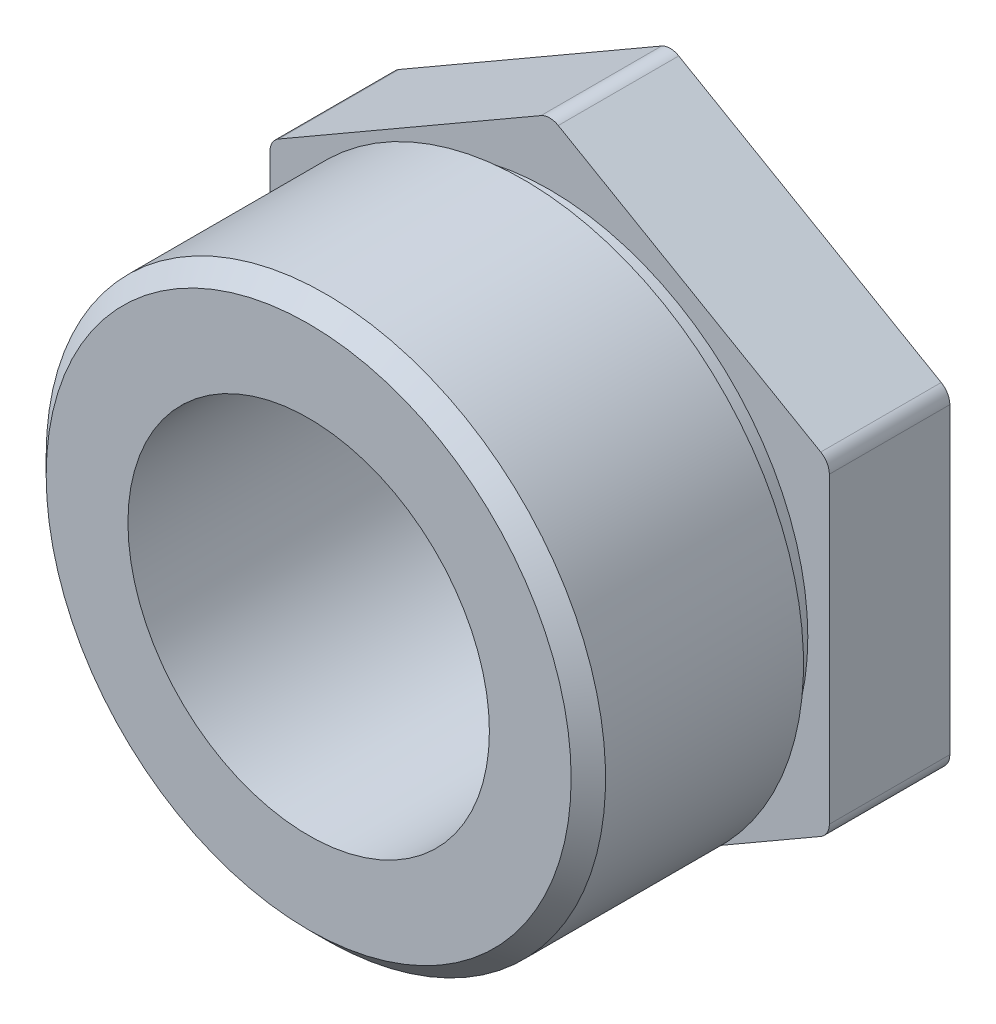
ISO-10303-21;
HEADER;
FILE_DESCRIPTION(('STEP AP214'),'2;1');
FILE_NAME('part.step','',(''),(''),'','','');
FILE_SCHEMA(('AUTOMOTIVE_DESIGN { 1 0 10303 214 1 1 1 1 }'));
ENDSEC;
DATA;
#1=APPLICATION_CONTEXT('core data for automotive mechanical design processes');
#2=APPLICATION_PROTOCOL_DEFINITION('international standard','automotive_design',2000,#1);
#3=PRODUCT_CONTEXT('',#1,'mechanical');
#4=PRODUCT('Part','Part','',(#3));
#5=PRODUCT_RELATED_PRODUCT_CATEGORY('part','',(#4));
#6=PRODUCT_DEFINITION_FORMATION('','',#4);
#7=PRODUCT_DEFINITION_CONTEXT('part definition',#1,'design');
#8=PRODUCT_DEFINITION('design','',#6,#7);
#9=PRODUCT_DEFINITION_SHAPE('','',#8);
#10=(LENGTH_UNIT() NAMED_UNIT(*) SI_UNIT(.MILLI.,.METRE.));
#11=(NAMED_UNIT(*) PLANE_ANGLE_UNIT() SI_UNIT($,.RADIAN.));
#12=(NAMED_UNIT(*) SI_UNIT($,.STERADIAN.) SOLID_ANGLE_UNIT());
#13=UNCERTAINTY_MEASURE_WITH_UNIT(LENGTH_MEASURE(1.E-05),#10,'distance_accuracy_value','');
#14=(GEOMETRIC_REPRESENTATION_CONTEXT(3) GLOBAL_UNCERTAINTY_ASSIGNED_CONTEXT((#13)) GLOBAL_UNIT_ASSIGNED_CONTEXT((#10,
#11,#12)) REPRESENTATION_CONTEXT('',''));
#15=CARTESIAN_POINT('',(0.,0.,0.));
#16=DIRECTION('',(0.,0.,1.));
#17=DIRECTION('',(1.,0.,0.));
#18=AXIS2_PLACEMENT_3D('',#15,#16,#17);
#19=CARTESIAN_POINT('',(0.,0.,42.));
#20=DIRECTION('',(0.,0.,-1.));
#21=DIRECTION('',(-1.,0.,0.));
#22=AXIS2_PLACEMENT_3D('',#19,#20,#21);
#23=CYLINDRICAL_SURFACE('',#22,32.5);
#24=CARTESIAN_POINT('',(0.,0.,40.0000000000001));
#25=DIRECTION('',(0.,0.,1.));
#26=DIRECTION('',(1.,0.,0.));
#27=AXIS2_PLACEMENT_3D('',#24,#25,#26);
#28=CIRCLE('',#27,32.5);
#29=CARTESIAN_POINT('',(-32.5,0.,40.0000000000001));
#30=VERTEX_POINT('',#29);
#31=EDGE_CURVE('E11',#30,#30,#28,.F.);
#32=CARTESIAN_POINT('',(0.,0.,17.));
#33=DIRECTION('',(0.,0.,1.));
#34=DIRECTION('',(1.,0.,0.));
#35=AXIS2_PLACEMENT_3D('',#32,#33,#34);
#36=CIRCLE('',#35,32.5);
#37=CARTESIAN_POINT('',(-32.5,0.,17.));
#38=VERTEX_POINT('',#37);
#39=EDGE_CURVE('E163',#38,#38,#36,.T.);
#40=CARTESIAN_POINT('',(-32.5,0.,40.0000000000001));
#41=CARTESIAN_POINT('',(-32.5,0.,39.7604166666667));
#42=CARTESIAN_POINT('',(-32.5,0.,39.5208333333334));
#43=CARTESIAN_POINT('',(-32.5,0.,39.0416666666667));
#44=CARTESIAN_POINT('',(-32.5,0.,38.8020833333334));
#45=CARTESIAN_POINT('',(-32.5,0.,38.3229166666667));
#46=CARTESIAN_POINT('',(-32.5,0.,38.0833333333334));
#47=CARTESIAN_POINT('',(-32.5,0.,37.6041666666667));
#48=CARTESIAN_POINT('',(-32.5,0.,37.3645833333334));
#49=CARTESIAN_POINT('',(-32.5,0.,36.8854166666667));
#50=CARTESIAN_POINT('',(-32.5,0.,36.6458333333334));
#51=CARTESIAN_POINT('',(-32.5,0.,36.1666666666667));
#52=CARTESIAN_POINT('',(-32.5,0.,35.9270833333334));
#53=CARTESIAN_POINT('',(-32.5,0.,35.4479166666667));
#54=CARTESIAN_POINT('',(-32.5,0.,35.2083333333334));
#55=CARTESIAN_POINT('',(-32.5,0.,34.7291666666667));
#56=CARTESIAN_POINT('',(-32.5,0.,34.4895833333334));
#57=CARTESIAN_POINT('',(-32.5,0.,34.0104166666667));
#58=CARTESIAN_POINT('',(-32.5,0.,33.7708333333334));
#59=CARTESIAN_POINT('',(-32.5,0.,33.2916666666667));
#60=CARTESIAN_POINT('',(-32.5,0.,33.0520833333334));
#61=CARTESIAN_POINT('',(-32.5,0.,32.5729166666667));
#62=CARTESIAN_POINT('',(-32.5,0.,32.3333333333334));
#63=CARTESIAN_POINT('',(-32.5,0.,31.8541666666667));
#64=CARTESIAN_POINT('',(-32.5,0.,31.6145833333334));
#65=CARTESIAN_POINT('',(-32.5,0.,31.1354166666667));
#66=CARTESIAN_POINT('',(-32.5,0.,30.8958333333334));
#67=CARTESIAN_POINT('',(-32.5,0.,30.4166666666667));
#68=CARTESIAN_POINT('',(-32.5,0.,30.1770833333334));
#69=CARTESIAN_POINT('',(-32.5,0.,29.6979166666667));
#70=CARTESIAN_POINT('',(-32.5,0.,29.4583333333334));
#71=CARTESIAN_POINT('',(-32.5,0.,28.9791666666667));
#72=CARTESIAN_POINT('',(-32.5,0.,28.7395833333334));
#73=CARTESIAN_POINT('',(-32.5,0.,28.2604166666667));
#74=CARTESIAN_POINT('',(-32.5,0.,28.0208333333334));
#75=CARTESIAN_POINT('',(-32.5,0.,27.5416666666667));
#76=CARTESIAN_POINT('',(-32.5,0.,27.3020833333334));
#77=CARTESIAN_POINT('',(-32.5,0.,26.8229166666667));
#78=CARTESIAN_POINT('',(-32.5,0.,26.5833333333334));
#79=CARTESIAN_POINT('',(-32.5,0.,26.1041666666667));
#80=CARTESIAN_POINT('',(-32.5,0.,25.8645833333334));
#81=CARTESIAN_POINT('',(-32.5,0.,25.3854166666667));
#82=CARTESIAN_POINT('',(-32.5,0.,25.1458333333334));
#83=CARTESIAN_POINT('',(-32.5,0.,24.6666666666667));
#84=CARTESIAN_POINT('',(-32.5,0.,24.4270833333333));
#85=CARTESIAN_POINT('',(-32.5,0.,23.9479166666667));
#86=CARTESIAN_POINT('',(-32.5,0.,23.7083333333333));
#87=CARTESIAN_POINT('',(-32.5,0.,23.2291666666667));
#88=CARTESIAN_POINT('',(-32.5,0.,22.9895833333333));
#89=CARTESIAN_POINT('',(-32.5,0.,22.5104166666667));
#90=CARTESIAN_POINT('',(-32.5,0.,22.2708333333333));
#91=CARTESIAN_POINT('',(-32.5,0.,21.7916666666667));
#92=CARTESIAN_POINT('',(-32.5,0.,21.5520833333333));
#93=CARTESIAN_POINT('',(-32.5,0.,21.0729166666667));
#94=CARTESIAN_POINT('',(-32.5,0.,20.8333333333333));
#95=CARTESIAN_POINT('',(-32.5,0.,20.3541666666667));
#96=CARTESIAN_POINT('',(-32.5,0.,20.1145833333333));
#97=CARTESIAN_POINT('',(-32.5,0.,19.6354166666667));
#98=CARTESIAN_POINT('',(-32.5,0.,19.3958333333333));
#99=CARTESIAN_POINT('',(-32.5,0.,18.9166666666667));
#100=CARTESIAN_POINT('',(-32.5,0.,18.6770833333333));
#101=CARTESIAN_POINT('',(-32.5,0.,18.1979166666667));
#102=CARTESIAN_POINT('',(-32.5,0.,17.9583333333333));
#103=CARTESIAN_POINT('',(-32.5,0.,17.4791666666667));
#104=CARTESIAN_POINT('',(-32.5,0.,17.2395833333333));
#105=CARTESIAN_POINT('',(-32.5,0.,17.));
#106=B_SPLINE_CURVE_WITH_KNOTS('',3,(#40,#41,#42,#43,#44,#45,#46,#47,#48,#49,#50,#51,#52,#53,
#54,#55,#56,#57,#58,#59,#60,#61,#62,#63,#64,#65,#66,#67,#68,#69,#70,#71,#72,#73,#74,#75,#76,#77,
#78,#79,#80,#81,#82,#83,#84,#85,#86,#87,#88,#89,#90,#91,#92,#93,#94,#95,#96,#97,#98,#99,#100,
#101,#102,#103,#104,#105),.UNSPECIFIED.,.F.,.F.,(4,2,2,2,2,2,2,2,2,2,2,2,2,2,2,2,2,2,2,2,2,2,2,
2,2,2,2,2,2,2,2,2,4),(0.,0.718750000000004,1.43750000000001,2.15625000000001,2.87500000000001,
3.59375000000001,4.31250000000001,5.03125000000002,5.75000000000002,6.46875000000002,
7.18750000000002,7.90625000000002,8.62500000000002,9.34375000000002,10.0625,10.78125,11.5,
12.21875,12.9375,13.65625,14.375,15.09375,15.8125,16.53125,17.25,17.96875,18.6875,19.40625,
20.1250000000001,20.8437500000001,21.5625000000001,22.2812500000001,23.0000000000001),.UNSPECIFIED.);
#107=EDGE_CURVE('BSEAM45',#30,#38,#106,.T.);
#108=ORIENTED_EDGE('',*,*,#31,.T.);
#109=ORIENTED_EDGE('',*,*,#39,.T.);
#110=ORIENTED_EDGE('',*,*,#107,.T.);
#111=ORIENTED_EDGE('',*,*,#107,.F.);
#112=EDGE_LOOP('',(#108,#110,#109,#111));
#113=FACE_BOUND('',#112,.T.);
#114=ADVANCED_FACE('F45',(#113),#23,.T.);
#115=CARTESIAN_POINT('',(0.,0.,42.));
#116=DIRECTION('',(0.,0.,1.));
#117=DIRECTION('',(1.,0.,0.));
#118=AXIS2_PLACEMENT_3D('',#115,#116,#117);
#119=PLANE('',#118);
#120=CARTESIAN_POINT('',(0.,0.,42.));
#121=DIRECTION('',(0.,0.,1.));
#122=DIRECTION('',(1.,0.,0.));
#123=AXIS2_PLACEMENT_3D('',#120,#121,#122);
#124=CIRCLE('',#123,21.);
#125=CARTESIAN_POINT('',(21.,0.,42.));
#126=VERTEX_POINT('',#125);
#127=EDGE_CURVE('E499',#126,#126,#124,.T.);
#128=ORIENTED_EDGE('',*,*,#127,.F.);
#129=EDGE_LOOP('',(#128));
#130=FACE_BOUND('',#129,.T.);
#131=CARTESIAN_POINT('',(0.,0.,42.));
#132=DIRECTION('',(0.,0.,1.));
#133=DIRECTION('',(1.,0.,0.));
#134=AXIS2_PLACEMENT_3D('',#131,#132,#133);
#135=CIRCLE('',#134,30.5000000000001);
#136=CARTESIAN_POINT('',(30.5000000000001,0.,42.));
#137=VERTEX_POINT('',#136);
#138=EDGE_CURVE('E54',#137,#137,#135,.T.);
#139=ORIENTED_EDGE('',*,*,#138,.T.);
#140=EDGE_LOOP('',(#139));
#141=FACE_BOUND('',#140,.T.);
#142=ADVANCED_FACE('F214',(#130,#141),#119,.T.);
#143=CARTESIAN_POINT('',(0.,0.,17.));
#144=DIRECTION('',(0.,0.,1.));
#145=DIRECTION('',(1.,0.,0.));
#146=AXIS2_PLACEMENT_3D('',#143,#144,#145);
#147=PLANE('',#146);
#148=ORIENTED_EDGE('',*,*,#39,.F.);
#149=EDGE_LOOP('',(#148));
#150=FACE_BOUND('',#149,.T.);
#151=CARTESIAN_POINT('',(0.,0.,17.));
#152=DIRECTION('',(0.,0.,1.));
#153=DIRECTION('',(1.,0.,0.));
#154=AXIS2_PLACEMENT_3D('',#151,#152,#153);
#155=CIRCLE('',#154,30.);
#156=CARTESIAN_POINT('',(30.,0.,17.));
#157=VERTEX_POINT('',#156);
#158=EDGE_CURVE('E167',#157,#157,#155,.T.);
#159=ORIENTED_EDGE('',*,*,#158,.T.);
#160=EDGE_LOOP('',(#159));
#161=FACE_BOUND('',#160,.T.);
#162=ADVANCED_FACE('F234',(#150,#161),#147,.F.);
#163=CARTESIAN_POINT('',(0.,0.,14.));
#164=DIRECTION('',(0.,0.,1.));
#165=DIRECTION('',(1.,0.,0.));
#166=AXIS2_PLACEMENT_3D('',#163,#164,#165);
#167=PLANE('',#166);
#168=DIRECTION('',(-0.866025403784439,-0.5,0.));
#169=VECTOR('',#168,1.);
#170=CARTESIAN_POINT('',(32.5,-18.7638837486628,14.));
#171=LINE('',#170,#169);
#172=CARTESIAN_POINT('',(31.5,-19.3412340178525,14.));
#173=VERTEX_POINT('',#172);
#174=CARTESIAN_POINT('',(1.00000000000001,-36.9504172281361,14.));
#175=VERTEX_POINT('',#174);
#176=EDGE_CURVE('E492',#173,#175,#171,.T.);
#177=ORIENTED_EDGE('',*,*,#176,.F.);
#178=CARTESIAN_POINT('',(30.5,-17.6091832102836,14.));
#179=DIRECTION('',(0.,0.,1.));
#180=DIRECTION('',(1.,0.,0.));
#181=AXIS2_PLACEMENT_3D('',#178,#179,#180);
#182=CIRCLE('',#181,2.);
#183=CARTESIAN_POINT('',(32.5,-17.6091832102836,14.));
#184=VERTEX_POINT('',#183);
#185=EDGE_CURVE('E192',#173,#184,#182,.T.);
#186=ORIENTED_EDGE('',*,*,#185,.T.);
#187=DIRECTION('',(0.,-1.,0.));
#188=VECTOR('',#187,1.);
#189=CARTESIAN_POINT('',(32.5,18.7638837486628,14.));
#190=LINE('',#189,#188);
#191=CARTESIAN_POINT('',(32.5,17.6091832102836,14.));
#192=VERTEX_POINT('',#191);
#193=EDGE_CURVE('E495',#192,#184,#190,.T.);
#194=ORIENTED_EDGE('',*,*,#193,.F.);
#195=CARTESIAN_POINT('',(30.5,17.6091832102836,14.));
#196=DIRECTION('',(0.,0.,1.));
#197=DIRECTION('',(1.,0.,0.));
#198=AXIS2_PLACEMENT_3D('',#195,#196,#197);
#199=CIRCLE('',#198,2.);
#200=CARTESIAN_POINT('',(31.5,19.3412340178525,14.));
#201=VERTEX_POINT('',#200);
#202=EDGE_CURVE('E162',#192,#201,#199,.T.);
#203=ORIENTED_EDGE('',*,*,#202,.T.);
#204=DIRECTION('',(0.866025403784438,-0.5,0.));
#205=VECTOR('',#204,1.);
#206=CARTESIAN_POINT('',(0.,37.5277674973257,14.));
#207=LINE('',#206,#205);
#208=CARTESIAN_POINT('',(0.999999999999984,36.9504172281361,14.));
#209=VERTEX_POINT('',#208);
#210=EDGE_CURVE('E474',#209,#201,#207,.T.);
#211=ORIENTED_EDGE('',*,*,#210,.F.);
#212=CARTESIAN_POINT('',(0.,35.2183664205672,14.));
#213=DIRECTION('',(0.,0.,1.));
#214=DIRECTION('',(1.,0.,0.));
#215=AXIS2_PLACEMENT_3D('',#212,#213,#214);
#216=CIRCLE('',#215,2.);
#217=CARTESIAN_POINT('',(-1.00000000000003,36.9504172281361,14.));
#218=VERTEX_POINT('',#217);
#219=EDGE_CURVE('E184',#209,#218,#216,.T.);
#220=ORIENTED_EDGE('',*,*,#219,.T.);
#221=DIRECTION('',(0.866025403784439,0.5,0.));
#222=VECTOR('',#221,1.);
#223=CARTESIAN_POINT('',(-32.5,18.7638837486629,14.));
#224=LINE('',#223,#222);
#225=CARTESIAN_POINT('',(-31.5,19.3412340178525,14.));
#226=VERTEX_POINT('',#225);
#227=EDGE_CURVE('E469',#226,#218,#224,.T.);
#228=ORIENTED_EDGE('',*,*,#227,.F.);
#229=CARTESIAN_POINT('',(-30.5,17.6091832102836,14.));
#230=DIRECTION('',(0.,0.,1.));
#231=DIRECTION('',(1.,0.,0.));
#232=AXIS2_PLACEMENT_3D('',#229,#230,#231);
#233=CIRCLE('',#232,2.);
#234=CARTESIAN_POINT('',(-32.5,17.6091832102836,14.));
#235=VERTEX_POINT('',#234);
#236=EDGE_CURVE('E187',#226,#235,#233,.T.);
#237=ORIENTED_EDGE('',*,*,#236,.T.);
#238=DIRECTION('',(0.,1.,0.));
#239=VECTOR('',#238,1.);
#240=CARTESIAN_POINT('',(-32.5,-18.7638837486628,14.));
#241=LINE('',#240,#239);
#242=CARTESIAN_POINT('',(-32.5,-17.6091832102836,14.));
#243=VERTEX_POINT('',#242);
#244=EDGE_CURVE('E487',#243,#235,#241,.T.);
#245=ORIENTED_EDGE('',*,*,#244,.F.);
#246=CARTESIAN_POINT('',(-30.5,-17.6091832102836,14.));
#247=DIRECTION('',(0.,0.,1.));
#248=DIRECTION('',(1.,0.,0.));
#249=AXIS2_PLACEMENT_3D('',#246,#247,#248);
#250=CIRCLE('',#249,2.);
#251=CARTESIAN_POINT('',(-31.5,-19.3412340178525,14.));
#252=VERTEX_POINT('',#251);
#253=EDGE_CURVE('E61',#243,#252,#250,.T.);
#254=ORIENTED_EDGE('',*,*,#253,.T.);
#255=DIRECTION('',(-0.866025403784438,0.5,0.));
#256=VECTOR('',#255,1.);
#257=CARTESIAN_POINT('',(0.,-37.5277674973257,14.));
#258=LINE('',#257,#256);
#259=CARTESIAN_POINT('',(-0.999999999999991,-36.9504172281361,14.));
#260=VERTEX_POINT('',#259);
#261=EDGE_CURVE('E490',#260,#252,#258,.T.);
#262=ORIENTED_EDGE('',*,*,#261,.F.);
#263=CARTESIAN_POINT('',(0.,-35.2183664205672,14.));
#264=DIRECTION('',(0.,0.,1.));
#265=DIRECTION('',(1.,0.,0.));
#266=AXIS2_PLACEMENT_3D('',#263,#264,#265);
#267=CIRCLE('',#266,2.);
#268=EDGE_CURVE('E190',#260,#175,#267,.T.);
#269=ORIENTED_EDGE('',*,*,#268,.T.);
#270=EDGE_LOOP('',(#177,#186,#194,#203,#211,#220,#228,#237,#245,#254,#262,#269));
#271=FACE_BOUND('',#270,.T.);
#272=CARTESIAN_POINT('',(0.,0.,14.));
#273=DIRECTION('',(0.,0.,1.));
#274=DIRECTION('',(1.,0.,0.));
#275=AXIS2_PLACEMENT_3D('',#272,#273,#274);
#276=CIRCLE('',#275,30.);
#277=CARTESIAN_POINT('',(30.,0.,14.));
#278=VERTEX_POINT('',#277);
#279=EDGE_CURVE('E466',#278,#278,#276,.T.);
#280=ORIENTED_EDGE('',*,*,#279,.F.);
#281=EDGE_LOOP('',(#280));
#282=FACE_BOUND('',#281,.T.);
#283=ADVANCED_FACE('F398',(#271,#282),#167,.T.);
#284=CARTESIAN_POINT('',(0.,0.,17.));
#285=DIRECTION('',(0.,0.,-1.));
#286=DIRECTION('',(-1.,0.,0.));
#287=AXIS2_PLACEMENT_3D('',#284,#285,#286);
#288=CYLINDRICAL_SURFACE('',#287,30.);
#289=ORIENTED_EDGE('',*,*,#158,.F.);
#290=EDGE_LOOP('',(#289));
#291=FACE_BOUND('',#290,.T.);
#292=ORIENTED_EDGE('',*,*,#279,.T.);
#293=EDGE_LOOP('',(#292));
#294=FACE_BOUND('',#293,.T.);
#295=ADVANCED_FACE('F387',(#291,#294),#288,.T.);
#296=CARTESIAN_POINT('',(0.,37.5277674973257,14.));
#297=DIRECTION('',(0.5,0.866025403784438,0.));
#298=DIRECTION('',(-0.866025403784438,0.5,0.));
#299=AXIS2_PLACEMENT_3D('',#296,#297,#298);
#300=PLANE('',#299);
#301=ORIENTED_EDGE('',*,*,#210,.T.);
#302=DIRECTION('',(0.,0.,-1.));
#303=VECTOR('',#302,1.);
#304=CARTESIAN_POINT('',(31.5,19.3412340178525,14.));
#305=LINE('',#304,#303);
#306=CARTESIAN_POINT('',(31.5,19.3412340178525,0.));
#307=VERTEX_POINT('',#306);
#308=EDGE_CURVE('E210',#201,#307,#305,.T.);
#309=ORIENTED_EDGE('',*,*,#308,.T.);
#310=DIRECTION('',(0.866025403784438,-0.5,0.));
#311=VECTOR('',#310,1.);
#312=CARTESIAN_POINT('',(0.,37.5277674973257,0.));
#313=LINE('',#312,#311);
#314=CARTESIAN_POINT('',(0.999999999999984,36.9504172281361,0.));
#315=VERTEX_POINT('',#314);
#316=EDGE_CURVE('E142',#315,#307,#313,.T.);
#317=ORIENTED_EDGE('',*,*,#316,.F.);
#318=DIRECTION('',(0.,0.,-1.));
#319=VECTOR('',#318,1.);
#320=CARTESIAN_POINT('',(0.999999999999983,36.9504172281361,14.));
#321=LINE('',#320,#319);
#322=EDGE_CURVE('E208',#315,#209,#321,.F.);
#323=ORIENTED_EDGE('',*,*,#322,.T.);
#324=EDGE_LOOP('',(#301,#309,#317,#323));
#325=FACE_BOUND('',#324,.T.);
#326=ADVANCED_FACE('F377',(#325),#300,.T.);
#327=CARTESIAN_POINT('',(-32.5,18.7638837486629,14.));
#328=DIRECTION('',(-0.5,0.866025403784439,0.));
#329=DIRECTION('',(-0.866025403784439,-0.5,0.));
#330=AXIS2_PLACEMENT_3D('',#327,#328,#329);
#331=PLANE('',#330);
#332=DIRECTION('',(0.866025403784439,0.5,0.));
#333=VECTOR('',#332,1.);
#334=CARTESIAN_POINT('',(-32.5,18.7638837486629,0.));
#335=LINE('',#334,#333);
#336=CARTESIAN_POINT('',(-31.5,19.3412340178525,0.));
#337=VERTEX_POINT('',#336);
#338=CARTESIAN_POINT('',(-1.00000000000003,36.9504172281361,0.));
#339=VERTEX_POINT('',#338);
#340=EDGE_CURVE('E471',#337,#339,#335,.T.);
#341=ORIENTED_EDGE('',*,*,#340,.F.);
#342=DIRECTION('',(0.,0.,-1.));
#343=VECTOR('',#342,1.);
#344=CARTESIAN_POINT('',(-31.5,19.3412340178525,14.));
#345=LINE('',#344,#343);
#346=EDGE_CURVE('E206',#337,#226,#345,.F.);
#347=ORIENTED_EDGE('',*,*,#346,.T.);
#348=ORIENTED_EDGE('',*,*,#227,.T.);
#349=DIRECTION('',(0.,0.,-1.));
#350=VECTOR('',#349,1.);
#351=CARTESIAN_POINT('',(-1.00000000000003,36.9504172281361,14.));
#352=LINE('',#351,#350);
#353=EDGE_CURVE('E203',#218,#339,#352,.T.);
#354=ORIENTED_EDGE('',*,*,#353,.T.);
#355=EDGE_LOOP('',(#341,#347,#348,#354));
#356=FACE_BOUND('',#355,.T.);
#357=ADVANCED_FACE('F367',(#356),#331,.T.);
#358=CARTESIAN_POINT('',(-32.5,-18.7638837486628,14.));
#359=DIRECTION('',(-1.,0.,0.));
#360=DIRECTION('',(0.,-1.,0.));
#361=AXIS2_PLACEMENT_3D('',#358,#359,#360);
#362=PLANE('',#361);
#363=DIRECTION('',(0.,1.,0.));
#364=VECTOR('',#363,1.);
#365=CARTESIAN_POINT('',(-32.5,-18.7638837486628,0.));
#366=LINE('',#365,#364);
#367=CARTESIAN_POINT('',(-32.5,-17.6091832102836,0.));
#368=VERTEX_POINT('',#367);
#369=CARTESIAN_POINT('',(-32.5,17.6091832102836,0.));
#370=VERTEX_POINT('',#369);
#371=EDGE_CURVE('E475',#368,#370,#366,.T.);
#372=ORIENTED_EDGE('',*,*,#371,.F.);
#373=DIRECTION('',(0.,0.,-1.));
#374=VECTOR('',#373,1.);
#375=CARTESIAN_POINT('',(-32.5,-17.6091832102836,14.));
#376=LINE('',#375,#374);
#377=EDGE_CURVE('E201',#368,#243,#376,.F.);
#378=ORIENTED_EDGE('',*,*,#377,.T.);
#379=ORIENTED_EDGE('',*,*,#244,.T.);
#380=DIRECTION('',(0.,0.,-1.));
#381=VECTOR('',#380,1.);
#382=CARTESIAN_POINT('',(-32.5,17.6091832102836,14.));
#383=LINE('',#382,#381);
#384=EDGE_CURVE('E198',#235,#370,#383,.T.);
#385=ORIENTED_EDGE('',*,*,#384,.T.);
#386=EDGE_LOOP('',(#372,#378,#379,#385));
#387=FACE_BOUND('',#386,.T.);
#388=ADVANCED_FACE('F358',(#387),#362,.T.);
#389=CARTESIAN_POINT('',(0.,-37.5277674973257,14.));
#390=DIRECTION('',(-0.5,-0.866025403784438,0.));
#391=DIRECTION('',(0.866025403784438,-0.5,0.));
#392=AXIS2_PLACEMENT_3D('',#389,#390,#391);
#393=PLANE('',#392);
#394=DIRECTION('',(-0.866025403784438,0.5,0.));
#395=VECTOR('',#394,1.);
#396=CARTESIAN_POINT('',(0.,-37.5277674973257,0.));
#397=LINE('',#396,#395);
#398=CARTESIAN_POINT('',(-0.999999999999991,-36.9504172281361,0.));
#399=VERTEX_POINT('',#398);
#400=CARTESIAN_POINT('',(-31.5,-19.3412340178525,0.));
#401=VERTEX_POINT('',#400);
#402=EDGE_CURVE('E478',#399,#401,#397,.T.);
#403=ORIENTED_EDGE('',*,*,#402,.F.);
#404=DIRECTION('',(0.,0.,-1.));
#405=VECTOR('',#404,1.);
#406=CARTESIAN_POINT('',(-0.999999999999993,-36.9504172281361,14.));
#407=LINE('',#406,#405);
#408=EDGE_CURVE('E68',#399,#260,#407,.F.);
#409=ORIENTED_EDGE('',*,*,#408,.T.);
#410=ORIENTED_EDGE('',*,*,#261,.T.);
#411=DIRECTION('',(0.,0.,-1.));
#412=VECTOR('',#411,1.);
#413=CARTESIAN_POINT('',(-31.5,-19.3412340178524,14.));
#414=LINE('',#413,#412);
#415=EDGE_CURVE('E194',#252,#401,#414,.T.);
#416=ORIENTED_EDGE('',*,*,#415,.T.);
#417=EDGE_LOOP('',(#403,#409,#410,#416));
#418=FACE_BOUND('',#417,.T.);
#419=ADVANCED_FACE('F348',(#418),#393,.T.);
#420=CARTESIAN_POINT('',(32.5,-18.7638837486628,14.));
#421=DIRECTION('',(0.5,-0.866025403784439,0.));
#422=DIRECTION('',(0.866025403784439,0.5,0.));
#423=AXIS2_PLACEMENT_3D('',#420,#421,#422);
#424=PLANE('',#423);
#425=DIRECTION('',(-0.866025403784439,-0.5,0.));
#426=VECTOR('',#425,1.);
#427=CARTESIAN_POINT('',(32.5,-18.7638837486628,0.));
#428=LINE('',#427,#426);
#429=CARTESIAN_POINT('',(31.5,-19.3412340178525,0.));
#430=VERTEX_POINT('',#429);
#431=CARTESIAN_POINT('',(1.00000000000001,-36.9504172281361,0.));
#432=VERTEX_POINT('',#431);
#433=EDGE_CURVE('E158',#430,#432,#428,.T.);
#434=ORIENTED_EDGE('',*,*,#433,.F.);
#435=DIRECTION('',(0.,0.,-1.));
#436=VECTOR('',#435,1.);
#437=CARTESIAN_POINT('',(31.5,-19.3412340178525,14.));
#438=LINE('',#437,#436);
#439=EDGE_CURVE('E182',#430,#173,#438,.F.);
#440=ORIENTED_EDGE('',*,*,#439,.T.);
#441=ORIENTED_EDGE('',*,*,#176,.T.);
#442=DIRECTION('',(0.,0.,-1.));
#443=VECTOR('',#442,1.);
#444=CARTESIAN_POINT('',(1.00000000000001,-36.9504172281361,14.));
#445=LINE('',#444,#443);
#446=EDGE_CURVE('E179',#175,#432,#445,.T.);
#447=ORIENTED_EDGE('',*,*,#446,.T.);
#448=EDGE_LOOP('',(#434,#440,#441,#447));
#449=FACE_BOUND('',#448,.T.);
#450=ADVANCED_FACE('F339',(#449),#424,.T.);
#451=CARTESIAN_POINT('',(32.5,18.7638837486628,14.));
#452=DIRECTION('',(1.,0.,0.));
#453=DIRECTION('',(0.,1.,0.));
#454=AXIS2_PLACEMENT_3D('',#451,#452,#453);
#455=PLANE('',#454);
#456=ORIENTED_EDGE('',*,*,#193,.T.);
#457=DIRECTION('',(0.,0.,-1.));
#458=VECTOR('',#457,1.);
#459=CARTESIAN_POINT('',(32.5,-17.6091832102836,14.));
#460=LINE('',#459,#458);
#461=CARTESIAN_POINT('',(32.5,-17.6091832102836,0.));
#462=VERTEX_POINT('',#461);
#463=EDGE_CURVE('E157',#184,#462,#460,.T.);
#464=ORIENTED_EDGE('',*,*,#463,.T.);
#465=DIRECTION('',(0.,-1.,0.));
#466=VECTOR('',#465,1.);
#467=CARTESIAN_POINT('',(32.5,18.7638837486628,0.));
#468=LINE('',#467,#466);
#469=CARTESIAN_POINT('',(32.5,17.6091832102836,0.));
#470=VERTEX_POINT('',#469);
#471=EDGE_CURVE('E140',#470,#462,#468,.T.);
#472=ORIENTED_EDGE('',*,*,#471,.F.);
#473=DIRECTION('',(0.,0.,-1.));
#474=VECTOR('',#473,1.);
#475=CARTESIAN_POINT('',(32.5,17.6091832102836,14.));
#476=LINE('',#475,#474);
#477=EDGE_CURVE('E154',#470,#192,#476,.F.);
#478=ORIENTED_EDGE('',*,*,#477,.T.);
#479=EDGE_LOOP('',(#456,#464,#472,#478));
#480=FACE_BOUND('',#479,.T.);
#481=ADVANCED_FACE('F153',(#480),#455,.T.);
#482=CARTESIAN_POINT('',(0.,0.,0.));
#483=DIRECTION('',(0.,0.,1.));
#484=DIRECTION('',(1.,0.,0.));
#485=AXIS2_PLACEMENT_3D('',#482,#483,#484);
#486=PLANE('',#485);
#487=CARTESIAN_POINT('',(0.,0.,0.));
#488=DIRECTION('',(0.,0.,1.));
#489=DIRECTION('',(1.,0.,0.));
#490=AXIS2_PLACEMENT_3D('',#487,#488,#489);
#491=CIRCLE('',#490,21.);
#492=CARTESIAN_POINT('',(21.,0.,0.));
#493=VERTEX_POINT('',#492);
#494=EDGE_CURVE('E484',#493,#493,#491,.T.);
#495=ORIENTED_EDGE('',*,*,#494,.T.);
#496=EDGE_LOOP('',(#495));
#497=FACE_BOUND('',#496,.T.);
#498=ORIENTED_EDGE('',*,*,#471,.T.);
#499=CARTESIAN_POINT('',(30.5,-17.6091832102836,0.));
#500=DIRECTION('',(0.,0.,1.));
#501=DIRECTION('',(1.,0.,0.));
#502=AXIS2_PLACEMENT_3D('',#499,#500,#501);
#503=CIRCLE('',#502,2.);
#504=EDGE_CURVE('E177',#462,#430,#503,.F.);
#505=ORIENTED_EDGE('',*,*,#504,.T.);
#506=ORIENTED_EDGE('',*,*,#433,.T.);
#507=CARTESIAN_POINT('',(0.,-35.2183664205672,0.));
#508=DIRECTION('',(0.,0.,1.));
#509=DIRECTION('',(1.,0.,0.));
#510=AXIS2_PLACEMENT_3D('',#507,#508,#509);
#511=CIRCLE('',#510,2.);
#512=EDGE_CURVE('E175',#432,#399,#511,.F.);
#513=ORIENTED_EDGE('',*,*,#512,.T.);
#514=ORIENTED_EDGE('',*,*,#402,.T.);
#515=CARTESIAN_POINT('',(-30.5,-17.6091832102836,0.));
#516=DIRECTION('',(0.,0.,1.));
#517=DIRECTION('',(1.,0.,0.));
#518=AXIS2_PLACEMENT_3D('',#515,#516,#517);
#519=CIRCLE('',#518,2.);
#520=EDGE_CURVE('E173',#401,#368,#519,.F.);
#521=ORIENTED_EDGE('',*,*,#520,.T.);
#522=ORIENTED_EDGE('',*,*,#371,.T.);
#523=CARTESIAN_POINT('',(-30.5,17.6091832102836,0.));
#524=DIRECTION('',(0.,0.,1.));
#525=DIRECTION('',(1.,0.,0.));
#526=AXIS2_PLACEMENT_3D('',#523,#524,#525);
#527=CIRCLE('',#526,2.);
#528=EDGE_CURVE('E147',#370,#337,#527,.F.);
#529=ORIENTED_EDGE('',*,*,#528,.T.);
#530=ORIENTED_EDGE('',*,*,#340,.T.);
#531=CARTESIAN_POINT('',(0.,35.2183664205672,0.));
#532=DIRECTION('',(0.,0.,1.));
#533=DIRECTION('',(1.,0.,0.));
#534=AXIS2_PLACEMENT_3D('',#531,#532,#533);
#535=CIRCLE('',#534,2.);
#536=EDGE_CURVE('E148',#339,#315,#535,.F.);
#537=ORIENTED_EDGE('',*,*,#536,.T.);
#538=ORIENTED_EDGE('',*,*,#316,.T.);
#539=CARTESIAN_POINT('',(30.5,17.6091832102836,0.));
#540=DIRECTION('',(0.,0.,1.));
#541=DIRECTION('',(1.,0.,0.));
#542=AXIS2_PLACEMENT_3D('',#539,#540,#541);
#543=CIRCLE('',#542,2.);
#544=EDGE_CURVE('E137',#307,#470,#543,.F.);
#545=ORIENTED_EDGE('',*,*,#544,.T.);
#546=EDGE_LOOP('',(#498,#505,#506,#513,#514,#521,#522,#529,#530,#537,#538,#545));
#547=FACE_BOUND('',#546,.T.);
#548=ADVANCED_FACE('F139',(#497,#547),#486,.F.);
#549=CARTESIAN_POINT('',(30.5,-17.6091832102836,14.));
#550=DIRECTION('',(0.,0.,-1.));
#551=DIRECTION('',(-1.,0.,0.));
#552=AXIS2_PLACEMENT_3D('',#549,#550,#551);
#553=CYLINDRICAL_SURFACE('',#552,2.);
#554=ORIENTED_EDGE('',*,*,#185,.F.);
#555=ORIENTED_EDGE('',*,*,#439,.F.);
#556=ORIENTED_EDGE('',*,*,#504,.F.);
#557=ORIENTED_EDGE('',*,*,#463,.F.);
#558=EDGE_LOOP('',(#554,#555,#556,#557));
#559=FACE_BOUND('',#558,.T.);
#560=ADVANCED_FACE('F240',(#559),#553,.T.);
#561=CARTESIAN_POINT('',(0.,-35.2183664205672,14.));
#562=DIRECTION('',(0.,0.,-1.));
#563=DIRECTION('',(-1.,0.,0.));
#564=AXIS2_PLACEMENT_3D('',#561,#562,#563);
#565=CYLINDRICAL_SURFACE('',#564,2.);
#566=ORIENTED_EDGE('',*,*,#268,.F.);
#567=ORIENTED_EDGE('',*,*,#408,.F.);
#568=ORIENTED_EDGE('',*,*,#512,.F.);
#569=ORIENTED_EDGE('',*,*,#446,.F.);
#570=EDGE_LOOP('',(#566,#567,#568,#569));
#571=FACE_BOUND('',#570,.T.);
#572=ADVANCED_FACE('F243',(#571),#565,.T.);
#573=CARTESIAN_POINT('',(-30.5,-17.6091832102836,14.));
#574=DIRECTION('',(0.,0.,-1.));
#575=DIRECTION('',(-1.,0.,0.));
#576=AXIS2_PLACEMENT_3D('',#573,#574,#575);
#577=CYLINDRICAL_SURFACE('',#576,2.);
#578=ORIENTED_EDGE('',*,*,#253,.F.);
#579=ORIENTED_EDGE('',*,*,#377,.F.);
#580=ORIENTED_EDGE('',*,*,#520,.F.);
#581=ORIENTED_EDGE('',*,*,#415,.F.);
#582=EDGE_LOOP('',(#578,#579,#580,#581));
#583=FACE_BOUND('',#582,.T.);
#584=ADVANCED_FACE('F247',(#583),#577,.T.);
#585=CARTESIAN_POINT('',(-30.5,17.6091832102836,14.));
#586=DIRECTION('',(0.,0.,-1.));
#587=DIRECTION('',(-1.,0.,0.));
#588=AXIS2_PLACEMENT_3D('',#585,#586,#587);
#589=CYLINDRICAL_SURFACE('',#588,2.);
#590=ORIENTED_EDGE('',*,*,#236,.F.);
#591=ORIENTED_EDGE('',*,*,#346,.F.);
#592=ORIENTED_EDGE('',*,*,#528,.F.);
#593=ORIENTED_EDGE('',*,*,#384,.F.);
#594=EDGE_LOOP('',(#590,#591,#592,#593));
#595=FACE_BOUND('',#594,.T.);
#596=ADVANCED_FACE('F251',(#595),#589,.T.);
#597=CARTESIAN_POINT('',(30.5,17.6091832102836,14.));
#598=DIRECTION('',(0.,0.,-1.));
#599=DIRECTION('',(-1.,0.,0.));
#600=AXIS2_PLACEMENT_3D('',#597,#598,#599);
#601=CYLINDRICAL_SURFACE('',#600,2.);
#602=ORIENTED_EDGE('',*,*,#202,.F.);
#603=ORIENTED_EDGE('',*,*,#477,.F.);
#604=ORIENTED_EDGE('',*,*,#544,.F.);
#605=ORIENTED_EDGE('',*,*,#308,.F.);
#606=EDGE_LOOP('',(#602,#603,#604,#605));
#607=FACE_BOUND('',#606,.T.);
#608=ADVANCED_FACE('F161',(#607),#601,.T.);
#609=CARTESIAN_POINT('',(0.,35.2183664205672,14.));
#610=DIRECTION('',(0.,0.,-1.));
#611=DIRECTION('',(-1.,0.,0.));
#612=AXIS2_PLACEMENT_3D('',#609,#610,#611);
#613=CYLINDRICAL_SURFACE('',#612,2.);
#614=ORIENTED_EDGE('',*,*,#219,.F.);
#615=ORIENTED_EDGE('',*,*,#322,.F.);
#616=ORIENTED_EDGE('',*,*,#536,.F.);
#617=ORIENTED_EDGE('',*,*,#353,.F.);
#618=EDGE_LOOP('',(#614,#615,#616,#617));
#619=FACE_BOUND('',#618,.T.);
#620=ADVANCED_FACE('F218',(#619),#613,.T.);
#621=CARTESIAN_POINT('',(0.,0.,42.));
#622=DIRECTION('',(0.,0.,-1.));
#623=DIRECTION('',(-1.,0.,0.));
#624=AXIS2_PLACEMENT_3D('',#621,#622,#623);
#625=CONICAL_SURFACE('',#624,30.5000000000001,0.785398163397447);
#626=ORIENTED_EDGE('',*,*,#31,.F.);
#627=EDGE_LOOP('',(#626));
#628=FACE_BOUND('',#627,.T.);
#629=ORIENTED_EDGE('',*,*,#138,.F.);
#630=EDGE_LOOP('',(#629));
#631=FACE_BOUND('',#630,.T.);
#632=ADVANCED_FACE('F48',(#628,#631),#625,.T.);
#633=CARTESIAN_POINT('',(0.,0.,0.));
#634=DIRECTION('',(0.,0.,1.));
#635=DIRECTION('',(1.,0.,0.));
#636=AXIS2_PLACEMENT_3D('',#633,#634,#635);
#637=CYLINDRICAL_SURFACE('',#636,21.);
#638=CARTESIAN_POINT('',(21.,0.,0.));
#639=CARTESIAN_POINT('',(21.,0.,0.437499999999999));
#640=CARTESIAN_POINT('',(21.,0.,0.875));
#641=CARTESIAN_POINT('',(21.,0.,1.75));
#642=CARTESIAN_POINT('',(21.,0.,2.1875));
#643=CARTESIAN_POINT('',(21.,0.,3.0625));
#644=CARTESIAN_POINT('',(21.,0.,3.5));
#645=CARTESIAN_POINT('',(21.,0.,4.375));
#646=CARTESIAN_POINT('',(21.,0.,4.8125));
#647=CARTESIAN_POINT('',(21.,0.,5.6875));
#648=CARTESIAN_POINT('',(21.,0.,6.125));
#649=CARTESIAN_POINT('',(21.,0.,7.));
#650=CARTESIAN_POINT('',(21.,0.,7.4375));
#651=CARTESIAN_POINT('',(21.,0.,8.3125));
#652=CARTESIAN_POINT('',(21.,0.,8.75));
#653=CARTESIAN_POINT('',(21.,0.,9.625));
#654=CARTESIAN_POINT('',(21.,0.,10.0625));
#655=CARTESIAN_POINT('',(21.,0.,10.9375));
#656=CARTESIAN_POINT('',(21.,0.,11.375));
#657=CARTESIAN_POINT('',(21.,0.,12.25));
#658=CARTESIAN_POINT('',(21.,0.,12.6875));
#659=CARTESIAN_POINT('',(21.,0.,13.5625));
#660=CARTESIAN_POINT('',(21.,0.,14.));
#661=CARTESIAN_POINT('',(21.,0.,14.875));
#662=CARTESIAN_POINT('',(21.,0.,15.3125));
#663=CARTESIAN_POINT('',(21.,0.,16.1875));
#664=CARTESIAN_POINT('',(21.,0.,16.625));
#665=CARTESIAN_POINT('',(21.,0.,17.5));
#666=CARTESIAN_POINT('',(21.,0.,17.9375));
#667=CARTESIAN_POINT('',(21.,0.,18.8125));
#668=CARTESIAN_POINT('',(21.,0.,19.25));
#669=CARTESIAN_POINT('',(21.,0.,20.125));
#670=CARTESIAN_POINT('',(21.,0.,20.5625));
#671=CARTESIAN_POINT('',(21.,0.,21.4375));
#672=CARTESIAN_POINT('',(21.,0.,21.875));
#673=CARTESIAN_POINT('',(21.,0.,22.75));
#674=CARTESIAN_POINT('',(21.,0.,23.1875));
#675=CARTESIAN_POINT('',(21.,0.,24.0625));
#676=CARTESIAN_POINT('',(21.,0.,24.5));
#677=CARTESIAN_POINT('',(21.,0.,25.375));
#678=CARTESIAN_POINT('',(21.,0.,25.8125));
#679=CARTESIAN_POINT('',(21.,0.,26.6875));
#680=CARTESIAN_POINT('',(21.,0.,27.125));
#681=CARTESIAN_POINT('',(21.,0.,28.));
#682=CARTESIAN_POINT('',(21.,0.,28.4375));
#683=CARTESIAN_POINT('',(21.,0.,29.3125));
#684=CARTESIAN_POINT('',(21.,0.,29.75));
#685=CARTESIAN_POINT('',(21.,0.,30.625));
#686=CARTESIAN_POINT('',(21.,0.,31.0625));
#687=CARTESIAN_POINT('',(21.,0.,31.9375));
#688=CARTESIAN_POINT('',(21.,0.,32.375));
#689=CARTESIAN_POINT('',(21.,0.,33.25));
#690=CARTESIAN_POINT('',(21.,0.,33.6875));
#691=CARTESIAN_POINT('',(21.,0.,34.5625));
#692=CARTESIAN_POINT('',(21.,0.,35.));
#693=CARTESIAN_POINT('',(21.,0.,35.875));
#694=CARTESIAN_POINT('',(21.,0.,36.3125));
#695=CARTESIAN_POINT('',(21.,0.,37.1875));
#696=CARTESIAN_POINT('',(21.,0.,37.625));
#697=CARTESIAN_POINT('',(21.,0.,38.5));
#698=CARTESIAN_POINT('',(21.,0.,38.9375));
#699=CARTESIAN_POINT('',(21.,0.,39.8125));
#700=CARTESIAN_POINT('',(21.,0.,40.25));
#701=CARTESIAN_POINT('',(21.,0.,41.125));
#702=CARTESIAN_POINT('',(21.,0.,41.5625));
#703=CARTESIAN_POINT('',(21.,0.,42.));
#704=B_SPLINE_CURVE_WITH_KNOTS('',3,(#638,#639,#640,#641,#642,#643,#644,#645,#646,#647,#648,
#649,#650,#651,#652,#653,#654,#655,#656,#657,#658,#659,#660,#661,#662,#663,#664,#665,#666,#667,
#668,#669,#670,#671,#672,#673,#674,#675,#676,#677,#678,#679,#680,#681,#682,#683,#684,#685,#686,
#687,#688,#689,#690,#691,#692,#693,#694,#695,#696,#697,#698,#699,#700,#701,#702,#703),
.UNSPECIFIED.,.F.,.F.,(4,2,2,2,2,2,2,2,2,2,2,2,2,2,2,2,2,2,2,2,2,2,2,2,2,2,2,2,2,2,2,2,4),(0.,
1.3125,2.625,3.9375,5.25,6.5625,7.875,9.1875,10.5,11.8125,13.125,14.4375,15.75,17.0625,18.375,
19.6875,21.,22.3125,23.625,24.9375,26.25,27.5625,28.875,30.1875,31.5,32.8125,34.125,35.4375,
36.75,38.0625,39.375,40.6875,42.),.UNSPECIFIED.);
#705=EDGE_CURVE('BSEAM217',#493,#126,#704,.T.);
#706=ORIENTED_EDGE('',*,*,#494,.F.);
#707=ORIENTED_EDGE('',*,*,#127,.T.);
#708=ORIENTED_EDGE('',*,*,#705,.T.);
#709=ORIENTED_EDGE('',*,*,#705,.F.);
#710=EDGE_LOOP('',(#706,#708,#707,#709));
#711=FACE_BOUND('',#710,.T.);
#712=ADVANCED_FACE('F217',(#711),#637,.F.);
#713=CLOSED_SHELL('',(#114,#142,#162,#283,#295,#326,#357,#388,#419,#450,#481,#548,#560,#572,
#584,#596,#608,#620,#632,#712));
#714=MANIFOLD_SOLID_BREP('B2',#713);
#715=ADVANCED_BREP_SHAPE_REPRESENTATION('',(#18,#714),#14);
#716=SHAPE_DEFINITION_REPRESENTATION(#9,#715);
ENDSEC;
END-ISO-10303-21;
